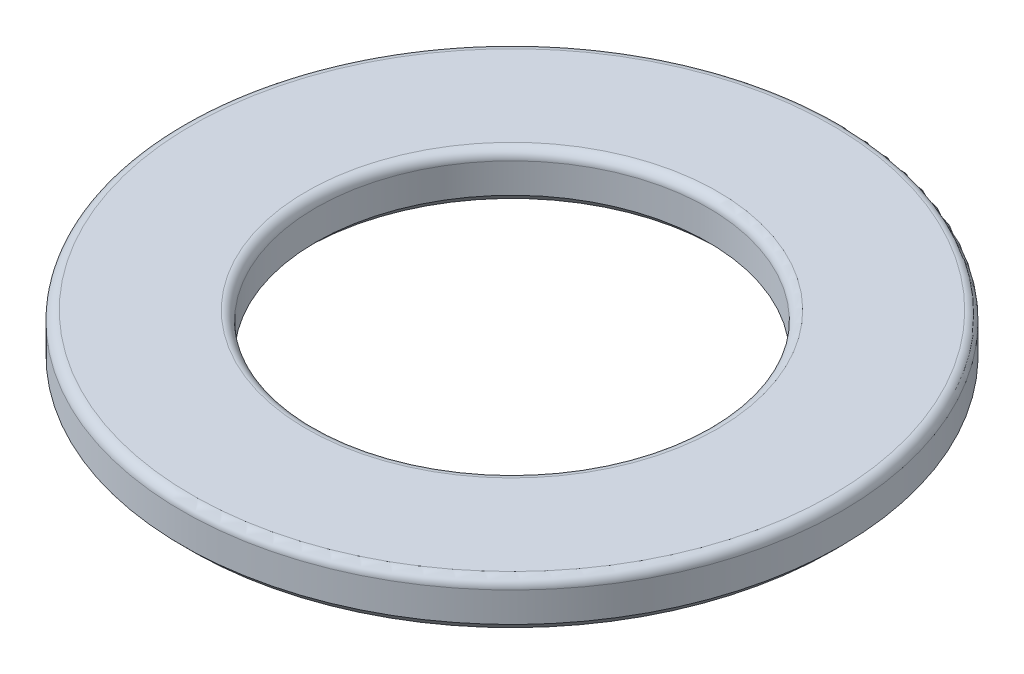
ISO-10303-21;
HEADER;
FILE_DESCRIPTION(('STEP AP214'),'2;1');
FILE_NAME('part.step','',(''),(''),'','','');
FILE_SCHEMA(('AUTOMOTIVE_DESIGN { 1 0 10303 214 1 1 1 1 }'));
ENDSEC;
DATA;
#1=APPLICATION_CONTEXT('core data for automotive mechanical design processes');
#2=APPLICATION_PROTOCOL_DEFINITION('international standard','automotive_design',2000,#1);
#3=PRODUCT_CONTEXT('',#1,'mechanical');
#4=PRODUCT('Part','Part','',(#3));
#5=PRODUCT_RELATED_PRODUCT_CATEGORY('part','',(#4));
#6=PRODUCT_DEFINITION_FORMATION('','',#4);
#7=PRODUCT_DEFINITION_CONTEXT('part definition',#1,'design');
#8=PRODUCT_DEFINITION('design','',#6,#7);
#9=PRODUCT_DEFINITION_SHAPE('','',#8);
#10=(LENGTH_UNIT() NAMED_UNIT(*) SI_UNIT(.MILLI.,.METRE.));
#11=(NAMED_UNIT(*) PLANE_ANGLE_UNIT() SI_UNIT($,.RADIAN.));
#12=(NAMED_UNIT(*) SI_UNIT($,.STERADIAN.) SOLID_ANGLE_UNIT());
#13=UNCERTAINTY_MEASURE_WITH_UNIT(LENGTH_MEASURE(1.E-05),#10,'distance_accuracy_value','');
#14=(GEOMETRIC_REPRESENTATION_CONTEXT(3) GLOBAL_UNCERTAINTY_ASSIGNED_CONTEXT((#13)) GLOBAL_UNIT_ASSIGNED_CONTEXT((#10,
#11,#12)) REPRESENTATION_CONTEXT('',''));
#15=CARTESIAN_POINT('',(0.,0.,0.));
#16=DIRECTION('',(0.,0.,1.));
#17=DIRECTION('',(1.,0.,0.));
#18=AXIS2_PLACEMENT_3D('',#15,#16,#17);
#19=CARTESIAN_POINT('',(16.75,11.,0.));
#20=DIRECTION('',(0.,1.,0.));
#21=DIRECTION('',(-1.,0.,0.));
#22=AXIS2_PLACEMENT_3D('',#19,#20,#21);
#23=PLANE('',#22);
#24=CARTESIAN_POINT('',(0.,11.,0.));
#25=DIRECTION('',(0.,-1.,0.));
#26=DIRECTION('',(1.,0.,0.));
#27=AXIS2_PLACEMENT_3D('',#24,#25,#26);
#28=CIRCLE('',#27,13.1);
#29=CARTESIAN_POINT('',(13.1,11.,0.));
#30=VERTEX_POINT('',#29);
#31=EDGE_CURVE('E11',#30,#30,#28,.T.);
#32=ORIENTED_EDGE('',*,*,#31,.T.);
#33=EDGE_LOOP('',(#32));
#34=FACE_BOUND('',#33,.T.);
#35=CARTESIAN_POINT('',(0.,11.,0.));
#36=DIRECTION('',(0.,-1.,0.));
#37=DIRECTION('',(1.,0.,0.));
#38=AXIS2_PLACEMENT_3D('',#35,#36,#37);
#39=CIRCLE('',#38,20.4);
#40=CARTESIAN_POINT('',(20.4,11.,0.));
#41=VERTEX_POINT('',#40);
#42=EDGE_CURVE('E78',#41,#41,#39,.T.);
#43=ORIENTED_EDGE('',*,*,#42,.F.);
#44=EDGE_LOOP('',(#43));
#45=FACE_BOUND('',#44,.T.);
#46=ADVANCED_FACE('F17',(#34,#45),#23,.T.);
#47=CARTESIAN_POINT('',(0.,10.4,0.));
#48=DIRECTION('',(0.,-1.,0.));
#49=DIRECTION('',(0.,0.,-1.));
#50=AXIS2_PLACEMENT_3D('',#47,#48,#49);
#51=TOROIDAL_SURFACE('',#50,13.1,0.6);
#52=CARTESIAN_POINT('',(0.,10.4,0.));
#53=DIRECTION('',(0.,-1.,0.));
#54=DIRECTION('',(1.,0.,0.));
#55=AXIS2_PLACEMENT_3D('',#52,#53,#54);
#56=CIRCLE('',#55,12.5);
#57=CARTESIAN_POINT('',(12.5,10.4,0.));
#58=VERTEX_POINT('',#57);
#59=EDGE_CURVE('E26',#58,#58,#56,.T.);
#60=ORIENTED_EDGE('',*,*,#59,.T.);
#61=EDGE_LOOP('',(#60));
#62=FACE_BOUND('',#61,.T.);
#63=ORIENTED_EDGE('',*,*,#31,.F.);
#64=EDGE_LOOP('',(#63));
#65=FACE_BOUND('',#64,.T.);
#66=ADVANCED_FACE('F98',(#62,#65),#51,.T.);
#67=CARTESIAN_POINT('',(0.,9.45,0.));
#68=DIRECTION('',(0.,1.,0.));
#69=DIRECTION('',(1.,0.,0.));
#70=AXIS2_PLACEMENT_3D('',#67,#68,#69);
#71=CYLINDRICAL_SURFACE('',#70,12.5);
#72=CARTESIAN_POINT('',(0.,8.5,0.));
#73=DIRECTION('',(0.,-1.,0.));
#74=DIRECTION('',(1.,0.,0.));
#75=AXIS2_PLACEMENT_3D('',#72,#73,#74);
#76=CIRCLE('',#75,12.5);
#77=CARTESIAN_POINT('',(12.5,8.5,0.));
#78=VERTEX_POINT('',#77);
#79=EDGE_CURVE('E70',#78,#78,#76,.T.);
#80=ORIENTED_EDGE('',*,*,#79,.T.);
#81=EDGE_LOOP('',(#80));
#82=FACE_BOUND('',#81,.T.);
#83=ORIENTED_EDGE('',*,*,#59,.F.);
#84=EDGE_LOOP('',(#83));
#85=FACE_BOUND('',#84,.T.);
#86=ADVANCED_FACE('F102',(#82,#85),#71,.F.);
#87=CARTESIAN_POINT('',(0.,8.2,0.));
#88=DIRECTION('',(0.,-1.,0.));
#89=DIRECTION('',(1.,0.,0.));
#90=AXIS2_PLACEMENT_3D('',#87,#88,#89);
#91=CONICAL_SURFACE('',#90,12.8,0.785398163397448);
#92=CARTESIAN_POINT('',(0.,7.9,0.));
#93=DIRECTION('',(0.,-1.,0.));
#94=DIRECTION('',(1.,0.,0.));
#95=AXIS2_PLACEMENT_3D('',#92,#93,#94);
#96=CIRCLE('',#95,13.1);
#97=CARTESIAN_POINT('',(13.1,7.9,0.));
#98=VERTEX_POINT('',#97);
#99=EDGE_CURVE('E66',#98,#98,#96,.T.);
#100=ORIENTED_EDGE('',*,*,#99,.T.);
#101=EDGE_LOOP('',(#100));
#102=FACE_BOUND('',#101,.T.);
#103=ORIENTED_EDGE('',*,*,#79,.F.);
#104=EDGE_LOOP('',(#103));
#105=FACE_BOUND('',#104,.T.);
#106=ADVANCED_FACE('F67',(#102,#105),#91,.F.);
#107=CARTESIAN_POINT('',(14.025,7.9,0.));
#108=DIRECTION('',(0.,-1.,0.));
#109=DIRECTION('',(1.,0.,0.));
#110=AXIS2_PLACEMENT_3D('',#107,#108,#109);
#111=PLANE('',#110);
#112=CARTESIAN_POINT('',(0.,7.9,0.));
#113=DIRECTION('',(0.,-1.,0.));
#114=DIRECTION('',(1.,0.,0.));
#115=AXIS2_PLACEMENT_3D('',#112,#113,#114);
#116=CIRCLE('',#115,14.95);
#117=CARTESIAN_POINT('',(14.95,7.9,0.));
#118=VERTEX_POINT('',#117);
#119=EDGE_CURVE('E71',#118,#118,#116,.T.);
#120=ORIENTED_EDGE('',*,*,#119,.T.);
#121=EDGE_LOOP('',(#120));
#122=FACE_BOUND('',#121,.T.);
#123=ORIENTED_EDGE('',*,*,#99,.F.);
#124=EDGE_LOOP('',(#123));
#125=FACE_BOUND('',#124,.T.);
#126=ADVANCED_FACE('F118',(#122,#125),#111,.T.);
#127=CARTESIAN_POINT('',(0.,5.5,0.));
#128=DIRECTION('',(0.,-1.,0.));
#129=DIRECTION('',(0.,0.,-1.));
#130=AXIS2_PLACEMENT_3D('',#127,#128,#129);
#131=TOROIDAL_SURFACE('',#130,16.75,3.);
#132=CARTESIAN_POINT('',(0.,7.9,0.));
#133=DIRECTION('',(0.,-1.,0.));
#134=DIRECTION('',(1.,0.,0.));
#135=AXIS2_PLACEMENT_3D('',#132,#133,#134);
#136=CIRCLE('',#135,18.55);
#137=CARTESIAN_POINT('',(18.55,7.9,0.));
#138=VERTEX_POINT('',#137);
#139=EDGE_CURVE('E43',#138,#138,#136,.T.);
#140=ORIENTED_EDGE('',*,*,#139,.T.);
#141=EDGE_LOOP('',(#140));
#142=FACE_BOUND('',#141,.T.);
#143=ORIENTED_EDGE('',*,*,#119,.F.);
#144=EDGE_LOOP('',(#143));
#145=FACE_BOUND('',#144,.T.);
#146=ADVANCED_FACE('F116',(#142,#145),#131,.F.);
#147=CARTESIAN_POINT('',(19.475,7.9,0.));
#148=DIRECTION('',(0.,-1.,0.));
#149=DIRECTION('',(1.,0.,0.));
#150=AXIS2_PLACEMENT_3D('',#147,#148,#149);
#151=PLANE('',#150);
#152=CARTESIAN_POINT('',(0.,7.9,0.));
#153=DIRECTION('',(0.,-1.,0.));
#154=DIRECTION('',(1.,0.,0.));
#155=AXIS2_PLACEMENT_3D('',#152,#153,#154);
#156=CIRCLE('',#155,20.4);
#157=CARTESIAN_POINT('',(20.4,7.9,0.));
#158=VERTEX_POINT('',#157);
#159=EDGE_CURVE('E51',#158,#158,#156,.T.);
#160=ORIENTED_EDGE('',*,*,#159,.T.);
#161=EDGE_LOOP('',(#160));
#162=FACE_BOUND('',#161,.T.);
#163=ORIENTED_EDGE('',*,*,#139,.F.);
#164=EDGE_LOOP('',(#163));
#165=FACE_BOUND('',#164,.T.);
#166=ADVANCED_FACE('F113',(#162,#165),#151,.T.);
#167=CARTESIAN_POINT('',(0.,8.2,0.));
#168=DIRECTION('',(0.,1.,0.));
#169=DIRECTION('',(1.,0.,0.));
#170=AXIS2_PLACEMENT_3D('',#167,#168,#169);
#171=CONICAL_SURFACE('',#170,20.7,0.785398163397452);
#172=CARTESIAN_POINT('',(0.,8.5,0.));
#173=DIRECTION('',(0.,-1.,0.));
#174=DIRECTION('',(1.,0.,0.));
#175=AXIS2_PLACEMENT_3D('',#172,#173,#174);
#176=CIRCLE('',#175,21.);
#177=CARTESIAN_POINT('',(21.,8.5,0.));
#178=VERTEX_POINT('',#177);
#179=EDGE_CURVE('E56',#178,#178,#176,.T.);
#180=ORIENTED_EDGE('',*,*,#179,.T.);
#181=EDGE_LOOP('',(#180));
#182=FACE_BOUND('',#181,.T.);
#183=ORIENTED_EDGE('',*,*,#159,.F.);
#184=EDGE_LOOP('',(#183));
#185=FACE_BOUND('',#184,.T.);
#186=ADVANCED_FACE('F94',(#182,#185),#171,.T.);
#187=CARTESIAN_POINT('',(0.,9.45,0.));
#188=DIRECTION('',(0.,1.,0.));
#189=DIRECTION('',(1.,0.,0.));
#190=AXIS2_PLACEMENT_3D('',#187,#188,#189);
#191=CYLINDRICAL_SURFACE('',#190,21.);
#192=CARTESIAN_POINT('',(0.,10.4,0.));
#193=DIRECTION('',(0.,-1.,0.));
#194=DIRECTION('',(1.,0.,0.));
#195=AXIS2_PLACEMENT_3D('',#192,#193,#194);
#196=CIRCLE('',#195,21.);
#197=CARTESIAN_POINT('',(21.,10.4,0.));
#198=VERTEX_POINT('',#197);
#199=EDGE_CURVE('E20',#198,#198,#196,.T.);
#200=ORIENTED_EDGE('',*,*,#199,.T.);
#201=EDGE_LOOP('',(#200));
#202=FACE_BOUND('',#201,.T.);
#203=ORIENTED_EDGE('',*,*,#179,.F.);
#204=EDGE_LOOP('',(#203));
#205=FACE_BOUND('',#204,.T.);
#206=ADVANCED_FACE('F84',(#202,#205),#191,.T.);
#207=CARTESIAN_POINT('',(0.,10.4,0.));
#208=DIRECTION('',(0.,-1.,0.));
#209=DIRECTION('',(0.,0.,-1.));
#210=AXIS2_PLACEMENT_3D('',#207,#208,#209);
#211=TOROIDAL_SURFACE('',#210,20.4,0.6);
#212=ORIENTED_EDGE('',*,*,#42,.T.);
#213=EDGE_LOOP('',(#212));
#214=FACE_BOUND('',#213,.T.);
#215=ORIENTED_EDGE('',*,*,#199,.F.);
#216=EDGE_LOOP('',(#215));
#217=FACE_BOUND('',#216,.T.);
#218=ADVANCED_FACE('F87',(#214,#217),#211,.T.);
#219=CLOSED_SHELL('',(#46,#66,#86,#106,#126,#146,#166,#186,#206,#218));
#220=MANIFOLD_SOLID_BREP('B1',#219);
#221=ADVANCED_BREP_SHAPE_REPRESENTATION('',(#18,#220),#14);
#222=SHAPE_DEFINITION_REPRESENTATION(#9,#221);
ENDSEC;
END-ISO-10303-21;
